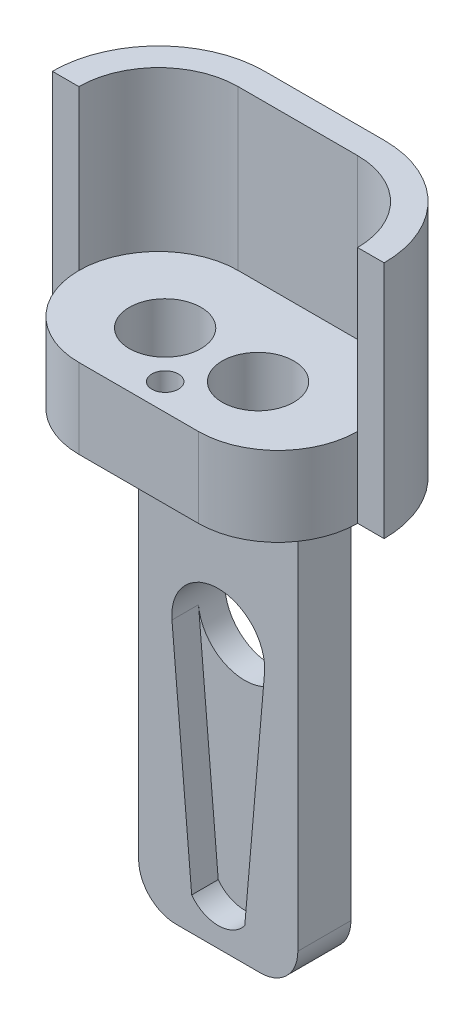
ISO-10303-21;
HEADER;
FILE_DESCRIPTION(('STEP AP214'),'2;1');
FILE_NAME('part.step','',(''),(''),'','','');
FILE_SCHEMA(('AUTOMOTIVE_DESIGN { 1 0 10303 214 1 1 1 1 }'));
ENDSEC;
DATA;
#1=APPLICATION_CONTEXT('core data for automotive mechanical design processes');
#2=APPLICATION_PROTOCOL_DEFINITION('international standard','automotive_design',2000,#1);
#3=PRODUCT_CONTEXT('',#1,'mechanical');
#4=PRODUCT('Part','Part','',(#3));
#5=PRODUCT_RELATED_PRODUCT_CATEGORY('part','',(#4));
#6=PRODUCT_DEFINITION_FORMATION('','',#4);
#7=PRODUCT_DEFINITION_CONTEXT('part definition',#1,'design');
#8=PRODUCT_DEFINITION('design','',#6,#7);
#9=PRODUCT_DEFINITION_SHAPE('','',#8);
#10=(LENGTH_UNIT() NAMED_UNIT(*) SI_UNIT(.MILLI.,.METRE.));
#11=(NAMED_UNIT(*) PLANE_ANGLE_UNIT() SI_UNIT($,.RADIAN.));
#12=(NAMED_UNIT(*) SI_UNIT($,.STERADIAN.) SOLID_ANGLE_UNIT());
#13=UNCERTAINTY_MEASURE_WITH_UNIT(LENGTH_MEASURE(1.E-05),#10,'distance_accuracy_value','');
#14=(GEOMETRIC_REPRESENTATION_CONTEXT(3) GLOBAL_UNCERTAINTY_ASSIGNED_CONTEXT((#13)) GLOBAL_UNIT_ASSIGNED_CONTEXT((#10,
#11,#12)) REPRESENTATION_CONTEXT('',''));
#15=CARTESIAN_POINT('',(0.,0.,0.));
#16=DIRECTION('',(0.,0.,1.));
#17=DIRECTION('',(1.,0.,0.));
#18=AXIS2_PLACEMENT_3D('',#15,#16,#17);
#19=CARTESIAN_POINT('',(4.5,19.,0.));
#20=DIRECTION('',(0.,-1.,0.));
#21=DIRECTION('',(0.,0.,-1.));
#22=AXIS2_PLACEMENT_3D('',#19,#20,#21);
#23=CYLINDRICAL_SURFACE('',#22,6.);
#24=DIRECTION('',(0.,-1.,0.));
#25=VECTOR('',#24,1.);
#26=CARTESIAN_POINT('',(10.5,31.,0.));
#27=LINE('',#26,#25);
#28=CARTESIAN_POINT('',(10.5,19.,0.));
#29=VERTEX_POINT('',#28);
#30=CARTESIAN_POINT('',(10.5,13.,0.));
#31=VERTEX_POINT('',#30);
#32=EDGE_CURVE('E11',#29,#31,#27,.T.);
#33=ORIENTED_EDGE('',*,*,#32,.F.);
#34=CARTESIAN_POINT('',(4.5,19.,0.));
#35=DIRECTION('',(0.,1.,0.));
#36=DIRECTION('',(0.,0.,1.));
#37=AXIS2_PLACEMENT_3D('',#34,#35,#36);
#38=CIRCLE('',#37,6.);
#39=CARTESIAN_POINT('',(4.5,19.,6.));
#40=VERTEX_POINT('',#39);
#41=EDGE_CURVE('E25',#40,#29,#38,.T.);
#42=ORIENTED_EDGE('',*,*,#41,.F.);
#43=DIRECTION('',(0.,-1.,0.));
#44=VECTOR('',#43,1.);
#45=CARTESIAN_POINT('',(4.5,19.,6.));
#46=LINE('',#45,#44);
#47=CARTESIAN_POINT('',(4.5,13.,6.));
#48=VERTEX_POINT('',#47);
#49=EDGE_CURVE('E353',#40,#48,#46,.T.);
#50=ORIENTED_EDGE('',*,*,#49,.T.);
#51=CARTESIAN_POINT('',(4.5,13.,0.));
#52=DIRECTION('',(0.,1.,0.));
#53=DIRECTION('',(0.,0.,1.));
#54=AXIS2_PLACEMENT_3D('',#51,#52,#53);
#55=CIRCLE('',#54,6.);
#56=EDGE_CURVE('E351',#48,#31,#55,.T.);
#57=ORIENTED_EDGE('',*,*,#56,.T.);
#58=EDGE_LOOP('',(#33,#42,#50,#57));
#59=FACE_BOUND('',#58,.T.);
#60=ADVANCED_FACE('F17',(#59),#23,.T.);
#61=CARTESIAN_POINT('',(-3.17157287525382,-17.1715728752538,-4.));
#62=DIRECTION('',(0.,0.,1.));
#63=DIRECTION('',(1.,0.,0.));
#64=AXIS2_PLACEMENT_3D('',#61,#62,#63);
#65=CYLINDRICAL_SURFACE('',#64,2.82842712474618);
#66=DIRECTION('',(0.,0.,-1.));
#67=VECTOR('',#66,1.);
#68=CARTESIAN_POINT('',(-6.,-17.1715728752538,-4.));
#69=LINE('',#68,#67);
#70=CARTESIAN_POINT('',(-6.,-17.1715728752538,-4.));
#71=VERTEX_POINT('',#70);
#72=CARTESIAN_POINT('',(-6.,-17.1715728752538,0.));
#73=VERTEX_POINT('',#72);
#74=EDGE_CURVE('E348',#71,#73,#69,.F.);
#75=ORIENTED_EDGE('',*,*,#74,.F.);
#76=CARTESIAN_POINT('',(-3.17157287525382,-17.1715728752538,-4.));
#77=DIRECTION('',(0.,0.,1.));
#78=DIRECTION('',(1.,0.,0.));
#79=AXIS2_PLACEMENT_3D('',#76,#77,#78);
#80=CIRCLE('',#79,2.82842712474618);
#81=CARTESIAN_POINT('',(-3.17157287525381,-20.,-4.));
#82=VERTEX_POINT('',#81);
#83=EDGE_CURVE('E345',#82,#71,#80,.F.);
#84=ORIENTED_EDGE('',*,*,#83,.F.);
#85=DIRECTION('',(0.,0.,-1.));
#86=VECTOR('',#85,1.);
#87=CARTESIAN_POINT('',(-3.17157287525382,-20.,-4.));
#88=LINE('',#87,#86);
#89=CARTESIAN_POINT('',(-3.17157287525381,-20.,0.));
#90=VERTEX_POINT('',#89);
#91=EDGE_CURVE('E342',#90,#82,#88,.T.);
#92=ORIENTED_EDGE('',*,*,#91,.F.);
#93=CARTESIAN_POINT('',(-3.17157287525382,-17.1715728752538,0.));
#94=DIRECTION('',(0.,0.,1.));
#95=DIRECTION('',(1.,0.,0.));
#96=AXIS2_PLACEMENT_3D('',#93,#94,#95);
#97=CIRCLE('',#96,2.82842712474618);
#98=EDGE_CURVE('E339',#73,#90,#97,.T.);
#99=ORIENTED_EDGE('',*,*,#98,.F.);
#100=EDGE_LOOP('',(#75,#84,#92,#99));
#101=FACE_BOUND('',#100,.T.);
#102=ADVANCED_FACE('F398',(#101),#65,.T.);
#103=CARTESIAN_POINT('',(3.17157287525381,-17.1715728752538,-4.));
#104=DIRECTION('',(0.,0.,1.));
#105=DIRECTION('',(1.,0.,0.));
#106=AXIS2_PLACEMENT_3D('',#103,#104,#105);
#107=CYLINDRICAL_SURFACE('',#106,2.82842712474619);
#108=DIRECTION('',(0.,0.,1.));
#109=VECTOR('',#108,1.);
#110=CARTESIAN_POINT('',(3.17157287525381,-20.,-4.));
#111=LINE('',#110,#109);
#112=CARTESIAN_POINT('',(3.17157287525381,-20.,-4.));
#113=VERTEX_POINT('',#112);
#114=CARTESIAN_POINT('',(3.17157287525381,-20.,0.));
#115=VERTEX_POINT('',#114);
#116=EDGE_CURVE('E336',#113,#115,#111,.T.);
#117=ORIENTED_EDGE('',*,*,#116,.F.);
#118=CARTESIAN_POINT('',(3.17157287525381,-17.1715728752538,-4.));
#119=DIRECTION('',(0.,0.,1.));
#120=DIRECTION('',(1.,0.,0.));
#121=AXIS2_PLACEMENT_3D('',#118,#119,#120);
#122=CIRCLE('',#121,2.82842712474619);
#123=CARTESIAN_POINT('',(6.,-17.1715728752538,-4.));
#124=VERTEX_POINT('',#123);
#125=EDGE_CURVE('E333',#124,#113,#122,.F.);
#126=ORIENTED_EDGE('',*,*,#125,.F.);
#127=DIRECTION('',(0.,0.,1.));
#128=VECTOR('',#127,1.);
#129=CARTESIAN_POINT('',(6.,-17.1715728752538,-4.));
#130=LINE('',#129,#128);
#131=CARTESIAN_POINT('',(6.,-17.1715728752538,0.));
#132=VERTEX_POINT('',#131);
#133=EDGE_CURVE('E330',#132,#124,#130,.F.);
#134=ORIENTED_EDGE('',*,*,#133,.F.);
#135=CARTESIAN_POINT('',(3.17157287525381,-17.1715728752538,0.));
#136=DIRECTION('',(0.,0.,1.));
#137=DIRECTION('',(1.,0.,0.));
#138=AXIS2_PLACEMENT_3D('',#135,#136,#137);
#139=CIRCLE('',#138,2.82842712474619);
#140=EDGE_CURVE('E327',#115,#132,#139,.T.);
#141=ORIENTED_EDGE('',*,*,#140,.F.);
#142=EDGE_LOOP('',(#117,#126,#134,#141));
#143=FACE_BOUND('',#142,.T.);
#144=ADVANCED_FACE('F403',(#143),#107,.T.);
#145=CARTESIAN_POINT('',(0.,-4.,0.));
#146=DIRECTION('',(0.,0.,1.));
#147=DIRECTION('',(1.,0.,0.));
#148=AXIS2_PLACEMENT_3D('',#145,#146,#147);
#149=PLANE('',#148);
#150=DIRECTION('',(0.,1.,0.));
#151=VECTOR('',#150,1.);
#152=CARTESIAN_POINT('',(-6.,6.,0.));
#153=LINE('',#152,#151);
#154=CARTESIAN_POINT('',(-6.,13.,0.));
#155=VERTEX_POINT('',#154);
#156=EDGE_CURVE('E324',#73,#155,#153,.T.);
#157=ORIENTED_EDGE('',*,*,#156,.F.);
#158=ORIENTED_EDGE('',*,*,#98,.T.);
#159=DIRECTION('',(1.,0.,0.));
#160=VECTOR('',#159,1.);
#161=CARTESIAN_POINT('',(0.,-20.,0.));
#162=LINE('',#161,#160);
#163=EDGE_CURVE('E321',#90,#115,#162,.T.);
#164=ORIENTED_EDGE('',*,*,#163,.T.);
#165=ORIENTED_EDGE('',*,*,#140,.T.);
#166=DIRECTION('',(0.,1.,0.));
#167=VECTOR('',#166,1.);
#168=CARTESIAN_POINT('',(6.,-10.,0.));
#169=LINE('',#168,#167);
#170=CARTESIAN_POINT('',(6.,13.,0.));
#171=VERTEX_POINT('',#170);
#172=EDGE_CURVE('E319',#132,#171,#169,.T.);
#173=ORIENTED_EDGE('',*,*,#172,.T.);
#174=DIRECTION('',(1.,0.,0.));
#175=VECTOR('',#174,1.);
#176=CARTESIAN_POINT('',(0.,13.,0.));
#177=LINE('',#176,#175);
#178=EDGE_CURVE('E316',#155,#171,#177,.T.);
#179=ORIENTED_EDGE('',*,*,#178,.F.);
#180=EDGE_LOOP('',(#157,#158,#164,#165,#173,#179));
#181=FACE_BOUND('',#180,.T.);
#182=CARTESIAN_POINT('',(0.,-16.,0.));
#183=DIRECTION('',(0.,0.,1.));
#184=DIRECTION('',(1.,0.,0.));
#185=AXIS2_PLACEMENT_3D('',#182,#183,#184);
#186=CIRCLE('',#185,2.5);
#187=CARTESIAN_POINT('',(-2.,-17.5,0.));
#188=VERTEX_POINT('',#187);
#189=CARTESIAN_POINT('',(2.,-17.5,0.));
#190=VERTEX_POINT('',#189);
#191=EDGE_CURVE('E313',#188,#190,#186,.T.);
#192=ORIENTED_EDGE('',*,*,#191,.F.);
#193=DIRECTION('',(-0.086139071705837,0.996283122573928,0.));
#194=VECTOR('',#193,1.);
#195=CARTESIAN_POINT('',(-2.74349546450437,-8.90074337548521,0.));
#196=LINE('',#195,#194);
#197=CARTESIAN_POINT('',(-3.48699092900875,-0.301486750970427,0.));
#198=VERTEX_POINT('',#197);
#199=EDGE_CURVE('E311',#188,#198,#196,.T.);
#200=ORIENTED_EDGE('',*,*,#199,.T.);
#201=CARTESIAN_POINT('',(0.,0.,0.));
#202=DIRECTION('',(0.,0.,1.));
#203=DIRECTION('',(1.,0.,0.));
#204=AXIS2_PLACEMENT_3D('',#201,#202,#203);
#205=CIRCLE('',#204,3.5);
#206=CARTESIAN_POINT('',(3.48699092900875,-0.301486750970428,0.));
#207=VERTEX_POINT('',#206);
#208=EDGE_CURVE('E308',#207,#198,#205,.T.);
#209=ORIENTED_EDGE('',*,*,#208,.F.);
#210=DIRECTION('',(0.0861390717058367,0.996283122573928,0.));
#211=VECTOR('',#210,1.);
#212=CARTESIAN_POINT('',(2.74349546450437,-8.90074337548521,0.));
#213=LINE('',#212,#211);
#214=EDGE_CURVE('E305',#190,#207,#213,.T.);
#215=ORIENTED_EDGE('',*,*,#214,.F.);
#216=EDGE_LOOP('',(#192,#200,#209,#215));
#217=FACE_BOUND('',#216,.T.);
#218=ADVANCED_FACE('F408',(#181,#217),#149,.T.);
#219=CARTESIAN_POINT('',(-6.,6.,-4.));
#220=DIRECTION('',(1.,0.,0.));
#221=DIRECTION('',(0.,0.,-1.));
#222=AXIS2_PLACEMENT_3D('',#219,#220,#221);
#223=PLANE('',#222);
#224=DIRECTION('',(0.,1.,0.));
#225=VECTOR('',#224,1.);
#226=CARTESIAN_POINT('',(-6.,6.,-4.));
#227=LINE('',#226,#225);
#228=CARTESIAN_POINT('',(-6.,13.,-4.));
#229=VERTEX_POINT('',#228);
#230=EDGE_CURVE('E302',#71,#229,#227,.T.);
#231=ORIENTED_EDGE('',*,*,#230,.F.);
#232=ORIENTED_EDGE('',*,*,#74,.T.);
#233=ORIENTED_EDGE('',*,*,#156,.T.);
#234=DIRECTION('',(0.,0.,1.));
#235=VECTOR('',#234,1.);
#236=CARTESIAN_POINT('',(-6.,13.,-4.));
#237=LINE('',#236,#235);
#238=EDGE_CURVE('E299',#229,#155,#237,.T.);
#239=ORIENTED_EDGE('',*,*,#238,.F.);
#240=EDGE_LOOP('',(#231,#232,#233,#239));
#241=FACE_BOUND('',#240,.T.);
#242=ADVANCED_FACE('F414',(#241),#223,.F.);
#243=CARTESIAN_POINT('',(0.,-20.,-4.));
#244=DIRECTION('',(0.,-1.,0.));
#245=DIRECTION('',(0.,0.,-1.));
#246=AXIS2_PLACEMENT_3D('',#243,#244,#245);
#247=PLANE('',#246);
#248=ORIENTED_EDGE('',*,*,#163,.F.);
#249=ORIENTED_EDGE('',*,*,#91,.T.);
#250=DIRECTION('',(1.,0.,0.));
#251=VECTOR('',#250,1.);
#252=CARTESIAN_POINT('',(0.,-20.,-4.));
#253=LINE('',#252,#251);
#254=EDGE_CURVE('E296',#82,#113,#253,.T.);
#255=ORIENTED_EDGE('',*,*,#254,.T.);
#256=ORIENTED_EDGE('',*,*,#116,.T.);
#257=EDGE_LOOP('',(#248,#249,#255,#256));
#258=FACE_BOUND('',#257,.T.);
#259=ADVANCED_FACE('F418',(#258),#247,.T.);
#260=CARTESIAN_POINT('',(6.,-10.,-4.));
#261=DIRECTION('',(1.,0.,0.));
#262=DIRECTION('',(0.,0.,-1.));
#263=AXIS2_PLACEMENT_3D('',#260,#261,#262);
#264=PLANE('',#263);
#265=ORIENTED_EDGE('',*,*,#172,.F.);
#266=ORIENTED_EDGE('',*,*,#133,.T.);
#267=DIRECTION('',(0.,1.,0.));
#268=VECTOR('',#267,1.);
#269=CARTESIAN_POINT('',(6.,-10.,-4.));
#270=LINE('',#269,#268);
#271=CARTESIAN_POINT('',(6.,13.,-4.));
#272=VERTEX_POINT('',#271);
#273=EDGE_CURVE('E294',#124,#272,#270,.T.);
#274=ORIENTED_EDGE('',*,*,#273,.T.);
#275=DIRECTION('',(0.,0.,1.));
#276=VECTOR('',#275,1.);
#277=CARTESIAN_POINT('',(6.,13.,-4.));
#278=LINE('',#277,#276);
#279=EDGE_CURVE('E291',#272,#171,#278,.T.);
#280=ORIENTED_EDGE('',*,*,#279,.T.);
#281=EDGE_LOOP('',(#265,#266,#274,#280));
#282=FACE_BOUND('',#281,.T.);
#283=ADVANCED_FACE('F422',(#282),#264,.T.);
#284=CARTESIAN_POINT('',(0.,-4.,-4.));
#285=DIRECTION('',(0.,0.,1.));
#286=DIRECTION('',(1.,0.,0.));
#287=AXIS2_PLACEMENT_3D('',#284,#285,#286);
#288=PLANE('',#287);
#289=CARTESIAN_POINT('',(0.,0.,-4.));
#290=DIRECTION('',(0.,0.,1.));
#291=DIRECTION('',(1.,0.,0.));
#292=AXIS2_PLACEMENT_3D('',#289,#290,#291);
#293=CIRCLE('',#292,3.5);
#294=CARTESIAN_POINT('',(3.5,0.,-4.));
#295=VERTEX_POINT('',#294);
#296=EDGE_CURVE('E288',#295,#295,#293,.F.);
#297=ORIENTED_EDGE('',*,*,#296,.F.);
#298=EDGE_LOOP('',(#297));
#299=FACE_BOUND('',#298,.T.);
#300=ORIENTED_EDGE('',*,*,#254,.F.);
#301=ORIENTED_EDGE('',*,*,#83,.T.);
#302=ORIENTED_EDGE('',*,*,#230,.T.);
#303=DIRECTION('',(1.,0.,0.));
#304=VECTOR('',#303,1.);
#305=CARTESIAN_POINT('',(0.,13.,-4.));
#306=LINE('',#305,#304);
#307=EDGE_CURVE('E285',#229,#272,#306,.T.);
#308=ORIENTED_EDGE('',*,*,#307,.T.);
#309=ORIENTED_EDGE('',*,*,#273,.F.);
#310=ORIENTED_EDGE('',*,*,#125,.T.);
#311=EDGE_LOOP('',(#300,#301,#302,#308,#309,#310));
#312=FACE_BOUND('',#311,.T.);
#313=ADVANCED_FACE('F426',(#299,#312),#288,.F.);
#314=CARTESIAN_POINT('',(0.,0.,-4.002));
#315=DIRECTION('',(0.,0.,1.));
#316=DIRECTION('',(1.,0.,0.));
#317=AXIS2_PLACEMENT_3D('',#314,#315,#316);
#318=CYLINDRICAL_SURFACE('',#317,3.5);
#319=CARTESIAN_POINT('',(0.,0.,-2.));
#320=DIRECTION('',(0.,0.,1.));
#321=DIRECTION('',(1.,0.,0.));
#322=AXIS2_PLACEMENT_3D('',#319,#320,#321);
#323=CIRCLE('',#322,3.5);
#324=CARTESIAN_POINT('',(-3.48699092900875,-0.301486750970427,-2.));
#325=VERTEX_POINT('',#324);
#326=CARTESIAN_POINT('',(3.48699092900875,-0.301486750970428,-2.));
#327=VERTEX_POINT('',#326);
#328=EDGE_CURVE('E283',#325,#327,#323,.T.);
#329=ORIENTED_EDGE('',*,*,#328,.T.);
#330=DIRECTION('',(0.,0.,1.));
#331=VECTOR('',#330,1.);
#332=CARTESIAN_POINT('',(3.48699092900875,-0.301486750970428,-2.));
#333=LINE('',#332,#331);
#334=EDGE_CURVE('E280',#327,#207,#333,.T.);
#335=ORIENTED_EDGE('',*,*,#334,.T.);
#336=ORIENTED_EDGE('',*,*,#208,.T.);
#337=DIRECTION('',(0.,0.,1.));
#338=VECTOR('',#337,1.);
#339=CARTESIAN_POINT('',(-3.48699092900875,-0.301486750970427,-2.));
#340=LINE('',#339,#338);
#341=EDGE_CURVE('E277',#325,#198,#340,.T.);
#342=ORIENTED_EDGE('',*,*,#341,.F.);
#343=EDGE_LOOP('',(#329,#335,#336,#342));
#344=FACE_BOUND('',#343,.T.);
#345=ORIENTED_EDGE('',*,*,#296,.T.);
#346=EDGE_LOOP('',(#345));
#347=FACE_BOUND('',#346,.T.);
#348=ADVANCED_FACE('F430',(#344,#347),#318,.F.);
#349=CARTESIAN_POINT('',(-2.74349546450437,-8.90074337548521,-2.));
#350=DIRECTION('',(0.996283122573928,0.086139071705837,0.));
#351=DIRECTION('',(-0.086139071705837,0.996283122573928,0.));
#352=AXIS2_PLACEMENT_3D('',#349,#350,#351);
#353=PLANE('',#352);
#354=ORIENTED_EDGE('',*,*,#199,.F.);
#355=DIRECTION('',(0.,0.,1.));
#356=VECTOR('',#355,1.);
#357=CARTESIAN_POINT('',(-2.,-17.5,-2.));
#358=LINE('',#357,#356);
#359=CARTESIAN_POINT('',(-2.,-17.5,-2.));
#360=VERTEX_POINT('',#359);
#361=EDGE_CURVE('E274',#360,#188,#358,.T.);
#362=ORIENTED_EDGE('',*,*,#361,.F.);
#363=DIRECTION('',(-0.086139071705837,0.996283122573928,0.));
#364=VECTOR('',#363,1.);
#365=CARTESIAN_POINT('',(-2.74349546450437,-8.90074337548521,-2.));
#366=LINE('',#365,#364);
#367=EDGE_CURVE('E271',#360,#325,#366,.T.);
#368=ORIENTED_EDGE('',*,*,#367,.T.);
#369=ORIENTED_EDGE('',*,*,#341,.T.);
#370=EDGE_LOOP('',(#354,#362,#368,#369));
#371=FACE_BOUND('',#370,.T.);
#372=ADVANCED_FACE('F434',(#371),#353,.T.);
#373=CARTESIAN_POINT('',(0.,-16.,-2.));
#374=DIRECTION('',(0.,0.,1.));
#375=DIRECTION('',(1.,0.,0.));
#376=AXIS2_PLACEMENT_3D('',#373,#374,#375);
#377=CYLINDRICAL_SURFACE('',#376,2.5);
#378=ORIENTED_EDGE('',*,*,#191,.T.);
#379=DIRECTION('',(0.,0.,1.));
#380=VECTOR('',#379,1.);
#381=CARTESIAN_POINT('',(2.,-17.5,-2.));
#382=LINE('',#381,#380);
#383=CARTESIAN_POINT('',(2.,-17.5,-2.));
#384=VERTEX_POINT('',#383);
#385=EDGE_CURVE('E268',#384,#190,#382,.T.);
#386=ORIENTED_EDGE('',*,*,#385,.F.);
#387=CARTESIAN_POINT('',(0.,-16.,-2.));
#388=DIRECTION('',(0.,0.,1.));
#389=DIRECTION('',(1.,0.,0.));
#390=AXIS2_PLACEMENT_3D('',#387,#388,#389);
#391=CIRCLE('',#390,2.5);
#392=EDGE_CURVE('E265',#360,#384,#391,.T.);
#393=ORIENTED_EDGE('',*,*,#392,.F.);
#394=ORIENTED_EDGE('',*,*,#361,.T.);
#395=EDGE_LOOP('',(#378,#386,#393,#394));
#396=FACE_BOUND('',#395,.T.);
#397=ADVANCED_FACE('F438',(#396),#377,.F.);
#398=CARTESIAN_POINT('',(2.74349546450437,-8.90074337548521,-2.));
#399=DIRECTION('',(0.996283122573928,-0.0861390717058367,0.));
#400=DIRECTION('',(0.0861390717058367,0.996283122573928,0.));
#401=AXIS2_PLACEMENT_3D('',#398,#399,#400);
#402=PLANE('',#401);
#403=ORIENTED_EDGE('',*,*,#214,.T.);
#404=ORIENTED_EDGE('',*,*,#334,.F.);
#405=DIRECTION('',(0.0861390717058367,0.996283122573928,0.));
#406=VECTOR('',#405,1.);
#407=CARTESIAN_POINT('',(2.74349546450437,-8.90074337548521,-2.));
#408=LINE('',#407,#406);
#409=EDGE_CURVE('E262',#384,#327,#408,.T.);
#410=ORIENTED_EDGE('',*,*,#409,.F.);
#411=ORIENTED_EDGE('',*,*,#385,.T.);
#412=EDGE_LOOP('',(#403,#404,#410,#411));
#413=FACE_BOUND('',#412,.T.);
#414=ADVANCED_FACE('F442',(#413),#402,.F.);
#415=CARTESIAN_POINT('',(0.,-4.,-2.));
#416=DIRECTION('',(0.,0.,1.));
#417=DIRECTION('',(1.,0.,0.));
#418=AXIS2_PLACEMENT_3D('',#415,#416,#417);
#419=PLANE('',#418);
#420=ORIENTED_EDGE('',*,*,#367,.F.);
#421=ORIENTED_EDGE('',*,*,#392,.T.);
#422=ORIENTED_EDGE('',*,*,#409,.T.);
#423=ORIENTED_EDGE('',*,*,#328,.F.);
#424=EDGE_LOOP('',(#420,#421,#422,#423));
#425=FACE_BOUND('',#424,.T.);
#426=ADVANCED_FACE('F446',(#425),#419,.T.);
#427=CARTESIAN_POINT('',(0.,13.,0.));
#428=DIRECTION('',(0.,1.,0.));
#429=DIRECTION('',(-1.,0.,0.));
#430=AXIS2_PLACEMENT_3D('',#427,#428,#429);
#431=PLANE('',#430);
#432=CARTESIAN_POINT('',(-4.5,13.,0.));
#433=DIRECTION('',(0.,1.,0.));
#434=DIRECTION('',(0.,0.,1.));
#435=AXIS2_PLACEMENT_3D('',#432,#433,#434);
#436=CIRCLE('',#435,6.);
#437=CARTESIAN_POINT('',(-10.5,13.,0.));
#438=VERTEX_POINT('',#437);
#439=CARTESIAN_POINT('',(-4.5,13.,6.));
#440=VERTEX_POINT('',#439);
#441=EDGE_CURVE('E259',#438,#440,#436,.T.);
#442=ORIENTED_EDGE('',*,*,#441,.F.);
#443=DIRECTION('',(-1.,0.,0.));
#444=VECTOR('',#443,1.);
#445=CARTESIAN_POINT('',(-11.5,13.,0.));
#446=LINE('',#445,#444);
#447=CARTESIAN_POINT('',(-12.5,13.,0.));
#448=VERTEX_POINT('',#447);
#449=EDGE_CURVE('E257',#438,#448,#446,.T.);
#450=ORIENTED_EDGE('',*,*,#449,.T.);
#451=CARTESIAN_POINT('',(-4.5,13.,0.));
#452=DIRECTION('',(0.,1.,0.));
#453=DIRECTION('',(0.,0.,1.));
#454=AXIS2_PLACEMENT_3D('',#451,#452,#453);
#455=CIRCLE('',#454,8.);
#456=CARTESIAN_POINT('',(-4.5,13.,-8.));
#457=VERTEX_POINT('',#456);
#458=EDGE_CURVE('E163',#457,#448,#455,.T.);
#459=ORIENTED_EDGE('',*,*,#458,.F.);
#460=DIRECTION('',(1.,0.,0.));
#461=VECTOR('',#460,1.);
#462=CARTESIAN_POINT('',(0.,13.,-8.));
#463=LINE('',#462,#461);
#464=CARTESIAN_POINT('',(4.5,13.,-8.));
#465=VERTEX_POINT('',#464);
#466=EDGE_CURVE('E254',#457,#465,#463,.T.);
#467=ORIENTED_EDGE('',*,*,#466,.T.);
#468=CARTESIAN_POINT('',(4.5,13.,0.));
#469=DIRECTION('',(0.,1.,0.));
#470=DIRECTION('',(0.,0.,1.));
#471=AXIS2_PLACEMENT_3D('',#468,#469,#470);
#472=CIRCLE('',#471,8.);
#473=CARTESIAN_POINT('',(12.5,13.,0.));
#474=VERTEX_POINT('',#473);
#475=EDGE_CURVE('E251',#474,#465,#472,.T.);
#476=ORIENTED_EDGE('',*,*,#475,.F.);
#477=DIRECTION('',(-1.,0.,0.));
#478=VECTOR('',#477,1.);
#479=CARTESIAN_POINT('',(11.5,13.,0.));
#480=LINE('',#479,#478);
#481=EDGE_CURVE('E248',#474,#31,#480,.T.);
#482=ORIENTED_EDGE('',*,*,#481,.T.);
#483=ORIENTED_EDGE('',*,*,#56,.F.);
#484=DIRECTION('',(-1.,0.,0.));
#485=VECTOR('',#484,1.);
#486=CARTESIAN_POINT('',(0.,13.,6.));
#487=LINE('',#486,#485);
#488=EDGE_CURVE('E246',#48,#440,#487,.T.);
#489=ORIENTED_EDGE('',*,*,#488,.T.);
#490=EDGE_LOOP('',(#442,#450,#459,#467,#476,#482,#483,#489));
#491=FACE_BOUND('',#490,.T.);
#492=CARTESIAN_POINT('',(0.,13.,4.));
#493=DIRECTION('',(0.,1.,0.));
#494=DIRECTION('',(0.,0.,1.));
#495=AXIS2_PLACEMENT_3D('',#492,#493,#494);
#496=CIRCLE('',#495,1.);
#497=CARTESIAN_POINT('',(0.,13.,5.));
#498=VERTEX_POINT('',#497);
#499=EDGE_CURVE('E243',#498,#498,#496,.F.);
#500=ORIENTED_EDGE('',*,*,#499,.F.);
#501=EDGE_LOOP('',(#500));
#502=FACE_BOUND('',#501,.T.);
#503=ORIENTED_EDGE('',*,*,#238,.T.);
#504=ORIENTED_EDGE('',*,*,#178,.T.);
#505=ORIENTED_EDGE('',*,*,#279,.F.);
#506=ORIENTED_EDGE('',*,*,#307,.F.);
#507=EDGE_LOOP('',(#503,#504,#505,#506));
#508=FACE_BOUND('',#507,.T.);
#509=ADVANCED_FACE('F377',(#491,#502,#508),#431,.F.);
#510=CARTESIAN_POINT('',(-4.5,19.,0.));
#511=DIRECTION('',(0.,-1.,0.));
#512=DIRECTION('',(0.,0.,-1.));
#513=AXIS2_PLACEMENT_3D('',#510,#511,#512);
#514=CYLINDRICAL_SURFACE('',#513,6.);
#515=CARTESIAN_POINT('',(-4.5,19.,0.));
#516=DIRECTION('',(0.,1.,0.));
#517=DIRECTION('',(0.,0.,1.));
#518=AXIS2_PLACEMENT_3D('',#515,#516,#517);
#519=CIRCLE('',#518,6.);
#520=CARTESIAN_POINT('',(-10.5,19.,0.));
#521=VERTEX_POINT('',#520);
#522=CARTESIAN_POINT('',(-4.5,19.,6.));
#523=VERTEX_POINT('',#522);
#524=EDGE_CURVE('E242',#521,#523,#519,.T.);
#525=ORIENTED_EDGE('',*,*,#524,.F.);
#526=DIRECTION('',(0.,-1.,0.));
#527=VECTOR('',#526,1.);
#528=CARTESIAN_POINT('',(-10.5,31.,0.));
#529=LINE('',#528,#527);
#530=EDGE_CURVE('E238',#521,#438,#529,.T.);
#531=ORIENTED_EDGE('',*,*,#530,.T.);
#532=ORIENTED_EDGE('',*,*,#441,.T.);
#533=DIRECTION('',(0.,-1.,0.));
#534=VECTOR('',#533,1.);
#535=CARTESIAN_POINT('',(-4.5,19.,6.));
#536=LINE('',#535,#534);
#537=EDGE_CURVE('E235',#523,#440,#536,.T.);
#538=ORIENTED_EDGE('',*,*,#537,.F.);
#539=EDGE_LOOP('',(#525,#531,#532,#538));
#540=FACE_BOUND('',#539,.T.);
#541=ADVANCED_FACE('F375',(#540),#514,.T.);
#542=CARTESIAN_POINT('',(0.,19.,6.));
#543=DIRECTION('',(0.,0.,1.));
#544=DIRECTION('',(1.,0.,0.));
#545=AXIS2_PLACEMENT_3D('',#542,#543,#544);
#546=PLANE('',#545);
#547=ORIENTED_EDGE('',*,*,#488,.F.);
#548=ORIENTED_EDGE('',*,*,#49,.F.);
#549=DIRECTION('',(-1.,0.,0.));
#550=VECTOR('',#549,1.);
#551=CARTESIAN_POINT('',(0.,19.,6.));
#552=LINE('',#551,#550);
#553=EDGE_CURVE('E232',#40,#523,#552,.T.);
#554=ORIENTED_EDGE('',*,*,#553,.T.);
#555=ORIENTED_EDGE('',*,*,#537,.T.);
#556=EDGE_LOOP('',(#547,#548,#554,#555));
#557=FACE_BOUND('',#556,.T.);
#558=ADVANCED_FACE('F383',(#557),#546,.T.);
#559=CARTESIAN_POINT('',(0.,19.,0.));
#560=DIRECTION('',(0.,1.,0.));
#561=DIRECTION('',(-1.,0.,0.));
#562=AXIS2_PLACEMENT_3D('',#559,#560,#561);
#563=PLANE('',#562);
#564=CARTESIAN_POINT('',(-3.5,19.,0.5));
#565=DIRECTION('',(0.,1.,0.));
#566=DIRECTION('',(0.,0.,1.));
#567=AXIS2_PLACEMENT_3D('',#564,#565,#566);
#568=CIRCLE('',#567,2.7);
#569=CARTESIAN_POINT('',(-3.5,19.,3.2));
#570=VERTEX_POINT('',#569);
#571=EDGE_CURVE('E229',#570,#570,#568,.T.);
#572=ORIENTED_EDGE('',*,*,#571,.F.);
#573=EDGE_LOOP('',(#572));
#574=FACE_BOUND('',#573,.T.);
#575=CARTESIAN_POINT('',(3.5,19.,0.5));
#576=DIRECTION('',(0.,1.,0.));
#577=DIRECTION('',(0.,0.,1.));
#578=AXIS2_PLACEMENT_3D('',#575,#576,#577);
#579=CIRCLE('',#578,2.7);
#580=CARTESIAN_POINT('',(3.5,19.,3.2));
#581=VERTEX_POINT('',#580);
#582=EDGE_CURVE('E225',#581,#581,#579,.T.);
#583=ORIENTED_EDGE('',*,*,#582,.F.);
#584=EDGE_LOOP('',(#583));
#585=FACE_BOUND('',#584,.T.);
#586=CARTESIAN_POINT('',(0.,19.,4.));
#587=DIRECTION('',(0.,1.,0.));
#588=DIRECTION('',(0.,0.,1.));
#589=AXIS2_PLACEMENT_3D('',#586,#587,#588);
#590=CIRCLE('',#589,1.);
#591=CARTESIAN_POINT('',(0.,19.,5.));
#592=VERTEX_POINT('',#591);
#593=EDGE_CURVE('E222',#592,#592,#590,.T.);
#594=ORIENTED_EDGE('',*,*,#593,.F.);
#595=EDGE_LOOP('',(#594));
#596=FACE_BOUND('',#595,.T.);
#597=CARTESIAN_POINT('',(-4.5,19.,-6.));
#598=VERTEX_POINT('',#597);
#599=EDGE_CURVE('E226',#598,#521,#519,.T.);
#600=ORIENTED_EDGE('',*,*,#599,.T.);
#601=ORIENTED_EDGE('',*,*,#524,.T.);
#602=ORIENTED_EDGE('',*,*,#553,.F.);
#603=ORIENTED_EDGE('',*,*,#41,.T.);
#604=CARTESIAN_POINT('',(4.5,19.,-6.));
#605=VERTEX_POINT('',#604);
#606=EDGE_CURVE('E221',#29,#605,#38,.T.);
#607=ORIENTED_EDGE('',*,*,#606,.T.);
#608=DIRECTION('',(1.,0.,0.));
#609=VECTOR('',#608,1.);
#610=CARTESIAN_POINT('',(0.,19.,-6.));
#611=LINE('',#610,#609);
#612=EDGE_CURVE('E218',#598,#605,#611,.T.);
#613=ORIENTED_EDGE('',*,*,#612,.F.);
#614=EDGE_LOOP('',(#600,#601,#602,#603,#607,#613));
#615=FACE_BOUND('',#614,.T.);
#616=ADVANCED_FACE('F357',(#574,#585,#596,#615),#563,.T.);
#617=CARTESIAN_POINT('',(0.,-20.002,4.));
#618=DIRECTION('',(0.,1.,0.));
#619=DIRECTION('',(0.,0.,1.));
#620=AXIS2_PLACEMENT_3D('',#617,#618,#619);
#621=CYLINDRICAL_SURFACE('',#620,1.);
#622=ORIENTED_EDGE('',*,*,#499,.T.);
#623=EDGE_LOOP('',(#622));
#624=FACE_BOUND('',#623,.T.);
#625=ORIENTED_EDGE('',*,*,#593,.T.);
#626=EDGE_LOOP('',(#625));
#627=FACE_BOUND('',#626,.T.);
#628=ADVANCED_FACE('F459',(#624,#627),#621,.F.);
#629=CARTESIAN_POINT('',(3.5,14.,0.5));
#630=DIRECTION('',(0.,1.,0.));
#631=DIRECTION('',(0.,0.,1.));
#632=AXIS2_PLACEMENT_3D('',#629,#630,#631);
#633=CYLINDRICAL_SURFACE('',#632,2.7);
#634=CARTESIAN_POINT('',(3.5,14.,0.5));
#635=DIRECTION('',(0.,1.,0.));
#636=DIRECTION('',(0.,0.,1.));
#637=AXIS2_PLACEMENT_3D('',#634,#635,#636);
#638=CIRCLE('',#637,2.7);
#639=CARTESIAN_POINT('',(3.5,14.,3.2));
#640=VERTEX_POINT('',#639);
#641=EDGE_CURVE('E215',#640,#640,#638,.T.);
#642=ORIENTED_EDGE('',*,*,#641,.F.);
#643=EDGE_LOOP('',(#642));
#644=FACE_BOUND('',#643,.T.);
#645=ORIENTED_EDGE('',*,*,#582,.T.);
#646=EDGE_LOOP('',(#645));
#647=FACE_BOUND('',#646,.T.);
#648=ADVANCED_FACE('F463',(#644,#647),#633,.F.);
#649=CARTESIAN_POINT('',(0.,14.,0.));
#650=DIRECTION('',(0.,1.,0.));
#651=DIRECTION('',(-1.,0.,0.));
#652=AXIS2_PLACEMENT_3D('',#649,#650,#651);
#653=PLANE('',#652);
#654=ORIENTED_EDGE('',*,*,#641,.T.);
#655=EDGE_LOOP('',(#654));
#656=FACE_BOUND('',#655,.T.);
#657=ADVANCED_FACE('F467',(#656),#653,.T.);
#658=CARTESIAN_POINT('',(-3.5,14.,0.5));
#659=DIRECTION('',(0.,1.,0.));
#660=DIRECTION('',(0.,0.,1.));
#661=AXIS2_PLACEMENT_3D('',#658,#659,#660);
#662=CYLINDRICAL_SURFACE('',#661,2.7);
#663=CARTESIAN_POINT('',(-3.5,14.,0.5));
#664=DIRECTION('',(0.,1.,0.));
#665=DIRECTION('',(0.,0.,1.));
#666=AXIS2_PLACEMENT_3D('',#663,#664,#665);
#667=CIRCLE('',#666,2.7);
#668=CARTESIAN_POINT('',(-3.5,14.,3.2));
#669=VERTEX_POINT('',#668);
#670=EDGE_CURVE('E212',#669,#669,#667,.T.);
#671=ORIENTED_EDGE('',*,*,#670,.F.);
#672=EDGE_LOOP('',(#671));
#673=FACE_BOUND('',#672,.T.);
#674=ORIENTED_EDGE('',*,*,#571,.T.);
#675=EDGE_LOOP('',(#674));
#676=FACE_BOUND('',#675,.T.);
#677=ADVANCED_FACE('F471',(#673,#676),#662,.F.);
#678=CARTESIAN_POINT('',(0.,14.,0.));
#679=DIRECTION('',(0.,1.,0.));
#680=DIRECTION('',(-1.,0.,0.));
#681=AXIS2_PLACEMENT_3D('',#678,#679,#680);
#682=PLANE('',#681);
#683=ORIENTED_EDGE('',*,*,#670,.T.);
#684=EDGE_LOOP('',(#683));
#685=FACE_BOUND('',#684,.T.);
#686=ADVANCED_FACE('F475',(#685),#682,.T.);
#687=CARTESIAN_POINT('',(0.,31.,-6.));
#688=DIRECTION('',(0.,0.,-1.));
#689=DIRECTION('',(-1.,0.,0.));
#690=AXIS2_PLACEMENT_3D('',#687,#688,#689);
#691=PLANE('',#690);
#692=DIRECTION('',(0.,-1.,0.));
#693=VECTOR('',#692,1.);
#694=CARTESIAN_POINT('',(-4.5,31.,-6.));
#695=LINE('',#694,#693);
#696=CARTESIAN_POINT('',(-4.5,31.,-6.));
#697=VERTEX_POINT('',#696);
#698=EDGE_CURVE('E209',#697,#598,#695,.T.);
#699=ORIENTED_EDGE('',*,*,#698,.T.);
#700=ORIENTED_EDGE('',*,*,#612,.T.);
#701=DIRECTION('',(0.,-1.,0.));
#702=VECTOR('',#701,1.);
#703=CARTESIAN_POINT('',(4.5,31.,-6.));
#704=LINE('',#703,#702);
#705=CARTESIAN_POINT('',(4.5,31.,-6.));
#706=VERTEX_POINT('',#705);
#707=EDGE_CURVE('E206',#706,#605,#704,.T.);
#708=ORIENTED_EDGE('',*,*,#707,.F.);
#709=DIRECTION('',(1.,0.,0.));
#710=VECTOR('',#709,1.);
#711=CARTESIAN_POINT('',(0.,31.,-6.));
#712=LINE('',#711,#710);
#713=EDGE_CURVE('E203',#697,#706,#712,.T.);
#714=ORIENTED_EDGE('',*,*,#713,.F.);
#715=EDGE_LOOP('',(#699,#700,#708,#714));
#716=FACE_BOUND('',#715,.T.);
#717=ADVANCED_FACE('F369',(#716),#691,.F.);
#718=CARTESIAN_POINT('',(4.5,31.,0.));
#719=DIRECTION('',(0.,-1.,0.));
#720=DIRECTION('',(0.,0.,-1.));
#721=AXIS2_PLACEMENT_3D('',#718,#719,#720);
#722=CYLINDRICAL_SURFACE('',#721,6.);
#723=ORIENTED_EDGE('',*,*,#606,.F.);
#724=CARTESIAN_POINT('',(10.5,31.,0.));
#725=VERTEX_POINT('',#724);
#726=EDGE_CURVE('E20',#725,#29,#27,.T.);
#727=ORIENTED_EDGE('',*,*,#726,.F.);
#728=CARTESIAN_POINT('',(4.5,31.,0.));
#729=DIRECTION('',(0.,1.,0.));
#730=DIRECTION('',(0.,0.,1.));
#731=AXIS2_PLACEMENT_3D('',#728,#729,#730);
#732=CIRCLE('',#731,6.);
#733=EDGE_CURVE('E200',#725,#706,#732,.T.);
#734=ORIENTED_EDGE('',*,*,#733,.T.);
#735=ORIENTED_EDGE('',*,*,#707,.T.);
#736=EDGE_LOOP('',(#723,#727,#734,#735));
#737=FACE_BOUND('',#736,.T.);
#738=ADVANCED_FACE('F361',(#737),#722,.F.);
#739=CARTESIAN_POINT('',(-4.5,31.,0.));
#740=DIRECTION('',(0.,-1.,0.));
#741=DIRECTION('',(0.,0.,-1.));
#742=AXIS2_PLACEMENT_3D('',#739,#740,#741);
#743=CYLINDRICAL_SURFACE('',#742,6.);
#744=ORIENTED_EDGE('',*,*,#599,.F.);
#745=ORIENTED_EDGE('',*,*,#698,.F.);
#746=CARTESIAN_POINT('',(-4.5,31.,0.));
#747=DIRECTION('',(0.,1.,0.));
#748=DIRECTION('',(0.,0.,1.));
#749=AXIS2_PLACEMENT_3D('',#746,#747,#748);
#750=CIRCLE('',#749,6.);
#751=CARTESIAN_POINT('',(-10.5,31.,0.));
#752=VERTEX_POINT('',#751);
#753=EDGE_CURVE('E198',#697,#752,#750,.T.);
#754=ORIENTED_EDGE('',*,*,#753,.T.);
#755=EDGE_CURVE('E174',#752,#521,#529,.T.);
#756=ORIENTED_EDGE('',*,*,#755,.T.);
#757=EDGE_LOOP('',(#744,#745,#754,#756));
#758=FACE_BOUND('',#757,.T.);
#759=ADVANCED_FACE('F372',(#758),#743,.F.);
#760=CARTESIAN_POINT('',(11.5,31.,0.));
#761=DIRECTION('',(0.,0.,1.));
#762=DIRECTION('',(1.,0.,0.));
#763=AXIS2_PLACEMENT_3D('',#760,#761,#762);
#764=PLANE('',#763);
#765=ORIENTED_EDGE('',*,*,#481,.F.);
#766=DIRECTION('',(0.,-1.,0.));
#767=VECTOR('',#766,1.);
#768=CARTESIAN_POINT('',(12.5,31.,0.));
#769=LINE('',#768,#767);
#770=CARTESIAN_POINT('',(12.5,31.,0.));
#771=VERTEX_POINT('',#770);
#772=EDGE_CURVE('E195',#771,#474,#769,.T.);
#773=ORIENTED_EDGE('',*,*,#772,.F.);
#774=DIRECTION('',(-1.,0.,0.));
#775=VECTOR('',#774,1.);
#776=CARTESIAN_POINT('',(11.5,31.,0.));
#777=LINE('',#776,#775);
#778=EDGE_CURVE('E192',#771,#725,#777,.T.);
#779=ORIENTED_EDGE('',*,*,#778,.T.);
#780=ORIENTED_EDGE('',*,*,#726,.T.);
#781=ORIENTED_EDGE('',*,*,#32,.T.);
#782=EDGE_LOOP('',(#765,#773,#779,#780,#781));
#783=FACE_BOUND('',#782,.T.);
#784=ADVANCED_FACE('F364',(#783),#764,.T.);
#785=CARTESIAN_POINT('',(4.5,31.,0.));
#786=DIRECTION('',(0.,-1.,0.));
#787=DIRECTION('',(0.,0.,-1.));
#788=AXIS2_PLACEMENT_3D('',#785,#786,#787);
#789=CYLINDRICAL_SURFACE('',#788,8.);
#790=ORIENTED_EDGE('',*,*,#475,.T.);
#791=DIRECTION('',(0.,-1.,0.));
#792=VECTOR('',#791,1.);
#793=CARTESIAN_POINT('',(4.5,31.,-8.));
#794=LINE('',#793,#792);
#795=CARTESIAN_POINT('',(4.5,31.,-8.));
#796=VERTEX_POINT('',#795);
#797=EDGE_CURVE('E189',#796,#465,#794,.T.);
#798=ORIENTED_EDGE('',*,*,#797,.F.);
#799=CARTESIAN_POINT('',(4.5,31.,0.));
#800=DIRECTION('',(0.,1.,0.));
#801=DIRECTION('',(0.,0.,1.));
#802=AXIS2_PLACEMENT_3D('',#799,#800,#801);
#803=CIRCLE('',#802,8.);
#804=EDGE_CURVE('E187',#771,#796,#803,.T.);
#805=ORIENTED_EDGE('',*,*,#804,.F.);
#806=ORIENTED_EDGE('',*,*,#772,.T.);
#807=EDGE_LOOP('',(#790,#798,#805,#806));
#808=FACE_BOUND('',#807,.T.);
#809=ADVANCED_FACE('F385',(#808),#789,.T.);
#810=CARTESIAN_POINT('',(0.,31.,-8.));
#811=DIRECTION('',(0.,0.,-1.));
#812=DIRECTION('',(-1.,0.,0.));
#813=AXIS2_PLACEMENT_3D('',#810,#811,#812);
#814=PLANE('',#813);
#815=ORIENTED_EDGE('',*,*,#466,.F.);
#816=DIRECTION('',(0.,-1.,0.));
#817=VECTOR('',#816,1.);
#818=CARTESIAN_POINT('',(-4.5,31.,-8.));
#819=LINE('',#818,#817);
#820=CARTESIAN_POINT('',(-4.5,31.,-8.));
#821=VERTEX_POINT('',#820);
#822=EDGE_CURVE('E185',#821,#457,#819,.T.);
#823=ORIENTED_EDGE('',*,*,#822,.F.);
#824=DIRECTION('',(1.,0.,0.));
#825=VECTOR('',#824,1.);
#826=CARTESIAN_POINT('',(0.,31.,-8.));
#827=LINE('',#826,#825);
#828=EDGE_CURVE('E166',#821,#796,#827,.T.);
#829=ORIENTED_EDGE('',*,*,#828,.T.);
#830=ORIENTED_EDGE('',*,*,#797,.T.);
#831=EDGE_LOOP('',(#815,#823,#829,#830));
#832=FACE_BOUND('',#831,.T.);
#833=ADVANCED_FACE('F387',(#832),#814,.T.);
#834=CARTESIAN_POINT('',(-4.5,31.,0.));
#835=DIRECTION('',(0.,-1.,0.));
#836=DIRECTION('',(0.,0.,-1.));
#837=AXIS2_PLACEMENT_3D('',#834,#835,#836);
#838=CYLINDRICAL_SURFACE('',#837,8.);
#839=ORIENTED_EDGE('',*,*,#458,.T.);
#840=DIRECTION('',(0.,-1.,0.));
#841=VECTOR('',#840,1.);
#842=CARTESIAN_POINT('',(-12.5,31.,0.));
#843=LINE('',#842,#841);
#844=CARTESIAN_POINT('',(-12.5,31.,0.));
#845=VERTEX_POINT('',#844);
#846=EDGE_CURVE('E156',#845,#448,#843,.T.);
#847=ORIENTED_EDGE('',*,*,#846,.F.);
#848=CARTESIAN_POINT('',(-4.5,31.,0.));
#849=DIRECTION('',(0.,1.,0.));
#850=DIRECTION('',(0.,0.,1.));
#851=AXIS2_PLACEMENT_3D('',#848,#849,#850);
#852=CIRCLE('',#851,8.);
#853=EDGE_CURVE('E161',#821,#845,#852,.T.);
#854=ORIENTED_EDGE('',*,*,#853,.F.);
#855=ORIENTED_EDGE('',*,*,#822,.T.);
#856=EDGE_LOOP('',(#839,#847,#854,#855));
#857=FACE_BOUND('',#856,.T.);
#858=ADVANCED_FACE('F158',(#857),#838,.T.);
#859=CARTESIAN_POINT('',(-11.5,31.,0.));
#860=DIRECTION('',(0.,0.,1.));
#861=DIRECTION('',(1.,0.,0.));
#862=AXIS2_PLACEMENT_3D('',#859,#860,#861);
#863=PLANE('',#862);
#864=ORIENTED_EDGE('',*,*,#449,.F.);
#865=ORIENTED_EDGE('',*,*,#530,.F.);
#866=ORIENTED_EDGE('',*,*,#755,.F.);
#867=DIRECTION('',(-1.,0.,0.));
#868=VECTOR('',#867,1.);
#869=CARTESIAN_POINT('',(-11.5,31.,0.));
#870=LINE('',#869,#868);
#871=EDGE_CURVE('E170',#752,#845,#870,.T.);
#872=ORIENTED_EDGE('',*,*,#871,.T.);
#873=ORIENTED_EDGE('',*,*,#846,.T.);
#874=EDGE_LOOP('',(#864,#865,#866,#872,#873));
#875=FACE_BOUND('',#874,.T.);
#876=ADVANCED_FACE('F171',(#875),#863,.T.);
#877=CARTESIAN_POINT('',(0.,31.,0.));
#878=DIRECTION('',(0.,1.,0.));
#879=DIRECTION('',(-1.,0.,0.));
#880=AXIS2_PLACEMENT_3D('',#877,#878,#879);
#881=PLANE('',#880);
#882=ORIENTED_EDGE('',*,*,#733,.F.);
#883=ORIENTED_EDGE('',*,*,#778,.F.);
#884=ORIENTED_EDGE('',*,*,#804,.T.);
#885=ORIENTED_EDGE('',*,*,#828,.F.);
#886=ORIENTED_EDGE('',*,*,#853,.T.);
#887=ORIENTED_EDGE('',*,*,#871,.F.);
#888=ORIENTED_EDGE('',*,*,#753,.F.);
#889=ORIENTED_EDGE('',*,*,#713,.T.);
#890=EDGE_LOOP('',(#882,#883,#884,#885,#886,#887,#888,#889));
#891=FACE_BOUND('',#890,.T.);
#892=ADVANCED_FACE('F179',(#891),#881,.T.);
#893=CLOSED_SHELL('',(#60,#102,#144,#218,#242,#259,#283,#313,#348,#372,#397,#414,#426,#509,#541,
#558,#616,#628,#648,#657,#677,#686,#717,#738,#759,#784,#809,#833,#858,#876,#892));
#894=MANIFOLD_SOLID_BREP('B1',#893);
#895=ADVANCED_BREP_SHAPE_REPRESENTATION('',(#18,#894),#14);
#896=SHAPE_DEFINITION_REPRESENTATION(#9,#895);
ENDSEC;
END-ISO-10303-21;
